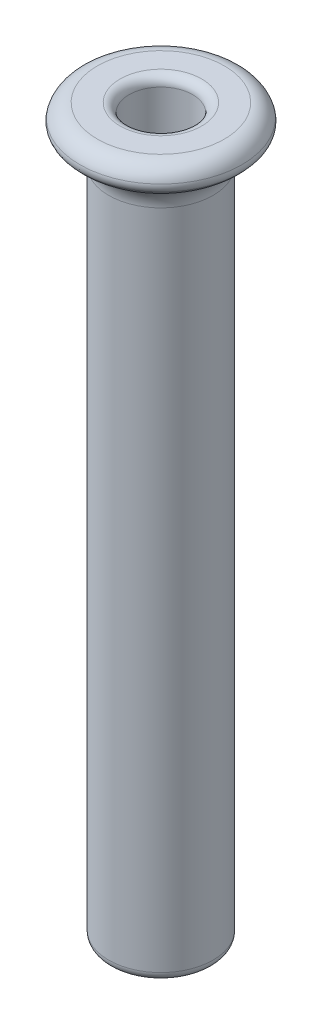
ISO-10303-21;
HEADER;
FILE_DESCRIPTION(('STEP AP214'),'2;1');
FILE_NAME('part.step','',(''),(''),'','','');
FILE_SCHEMA(('AUTOMOTIVE_DESIGN { 1 0 10303 214 1 1 1 1 }'));
ENDSEC;
DATA;
#1=APPLICATION_CONTEXT('core data for automotive mechanical design processes');
#2=APPLICATION_PROTOCOL_DEFINITION('international standard','automotive_design',2000,#1);
#3=PRODUCT_CONTEXT('',#1,'mechanical');
#4=PRODUCT('Part','Part','',(#3));
#5=PRODUCT_RELATED_PRODUCT_CATEGORY('part','',(#4));
#6=PRODUCT_DEFINITION_FORMATION('','',#4);
#7=PRODUCT_DEFINITION_CONTEXT('part definition',#1,'design');
#8=PRODUCT_DEFINITION('design','',#6,#7);
#9=PRODUCT_DEFINITION_SHAPE('','',#8);
#10=(LENGTH_UNIT() NAMED_UNIT(*) SI_UNIT(.MILLI.,.METRE.));
#11=(NAMED_UNIT(*) PLANE_ANGLE_UNIT() SI_UNIT($,.RADIAN.));
#12=(NAMED_UNIT(*) SI_UNIT($,.STERADIAN.) SOLID_ANGLE_UNIT());
#13=UNCERTAINTY_MEASURE_WITH_UNIT(LENGTH_MEASURE(1.E-05),#10,'distance_accuracy_value','');
#14=(GEOMETRIC_REPRESENTATION_CONTEXT(3) GLOBAL_UNCERTAINTY_ASSIGNED_CONTEXT((#13)) GLOBAL_UNIT_ASSIGNED_CONTEXT((#10,
#11,#12)) REPRESENTATION_CONTEXT('',''));
#15=CARTESIAN_POINT('',(0.,0.,0.));
#16=DIRECTION('',(0.,0.,1.));
#17=DIRECTION('',(1.,0.,0.));
#18=AXIS2_PLACEMENT_3D('',#15,#16,#17);
#19=CARTESIAN_POINT('',(2.70989670911976E-13,-79.,0.));
#20=DIRECTION('',(0.,-1.,0.));
#21=DIRECTION('',(1.,0.,0.));
#22=AXIS2_PLACEMENT_3D('',#19,#20,#21);
#23=TOROIDAL_SURFACE('',#22,4.74999999999986,1.);
#24=CARTESIAN_POINT('',(2.74419919910861E-13,-80.,0.));
#25=DIRECTION('',(0.,-1.,0.));
#26=DIRECTION('',(1.,0.,0.));
#27=AXIS2_PLACEMENT_3D('',#24,#25,#26);
#28=CIRCLE('',#27,4.74999999999986);
#29=CARTESIAN_POINT('',(4.75000000000014,-80.,0.));
#30=VERTEX_POINT('',#29);
#31=EDGE_CURVE('E71',#30,#30,#28,.T.);
#32=ORIENTED_EDGE('',*,*,#31,.F.);
#33=EDGE_LOOP('',(#32));
#34=FACE_BOUND('',#33,.T.);
#35=CARTESIAN_POINT('',(2.70989670911976E-13,-79.,0.));
#36=DIRECTION('',(0.,-1.,0.));
#37=DIRECTION('',(1.,0.,0.));
#38=AXIS2_PLACEMENT_3D('',#35,#36,#37);
#39=CIRCLE('',#38,5.74999999999987);
#40=CARTESIAN_POINT('',(5.75000000000014,-79.,0.));
#41=VERTEX_POINT('',#40);
#42=EDGE_CURVE('E68',#41,#41,#39,.F.);
#43=ORIENTED_EDGE('',*,*,#42,.F.);
#44=EDGE_LOOP('',(#43));
#45=FACE_BOUND('',#44,.T.);
#46=ADVANCED_FACE('F45',(#34,#45),#23,.T.);
#47=CARTESIAN_POINT('',(2.70989670911976E-13,-79.,0.));
#48=DIRECTION('',(0.,-1.,0.));
#49=DIRECTION('',(1.,0.,0.));
#50=AXIS2_PLACEMENT_3D('',#47,#48,#49);
#51=TOROIDAL_SURFACE('',#50,3.59999999999985,1.);
#52=CARTESIAN_POINT('',(2.74419919910861E-13,-80.,0.));
#53=DIRECTION('',(0.,-1.,0.));
#54=DIRECTION('',(1.,0.,0.));
#55=AXIS2_PLACEMENT_3D('',#52,#53,#54);
#56=CIRCLE('',#55,3.59999999999985);
#57=CARTESIAN_POINT('',(3.60000000000013,-80.,0.));
#58=VERTEX_POINT('',#57);
#59=EDGE_CURVE('E77',#58,#58,#56,.F.);
#60=ORIENTED_EDGE('',*,*,#59,.F.);
#61=EDGE_LOOP('',(#60));
#62=FACE_BOUND('',#61,.T.);
#63=CARTESIAN_POINT('',(2.70989670911976E-13,-79.,0.));
#64=DIRECTION('',(0.,-1.,0.));
#65=DIRECTION('',(1.,0.,0.));
#66=AXIS2_PLACEMENT_3D('',#63,#64,#65);
#67=CIRCLE('',#66,2.59999999999985);
#68=CARTESIAN_POINT('',(2.60000000000012,-79.,0.));
#69=VERTEX_POINT('',#68);
#70=EDGE_CURVE('E74',#69,#69,#67,.T.);
#71=ORIENTED_EDGE('',*,*,#70,.F.);
#72=EDGE_LOOP('',(#71));
#73=FACE_BOUND('',#72,.T.);
#74=ADVANCED_FACE('F111',(#62,#73),#51,.T.);
#75=CARTESIAN_POINT('',(0.,-8.50000000000001,0.));
#76=DIRECTION('',(0.,1.,0.));
#77=DIRECTION('',(-1.,0.,0.));
#78=AXIS2_PLACEMENT_3D('',#75,#76,#77);
#79=TOROIDAL_SURFACE('',#78,3.09999999999985,0.5);
#80=CARTESIAN_POINT('',(0.,-8.0417424305044,0.));
#81=DIRECTION('',(0.,-1.,0.));
#82=DIRECTION('',(1.,0.,0.));
#83=AXIS2_PLACEMENT_3D('',#80,#81,#82);
#84=CIRCLE('',#83,2.89999999999989);
#85=CARTESIAN_POINT('',(2.89999999999992,-8.04174243050439,0.));
#86=VERTEX_POINT('',#85);
#87=EDGE_CURVE('E52',#86,#86,#84,.F.);
#88=ORIENTED_EDGE('',*,*,#87,.T.);
#89=EDGE_LOOP('',(#88));
#90=FACE_BOUND('',#89,.T.);
#91=CARTESIAN_POINT('',(0.,-8.50000000000001,0.));
#92=DIRECTION('',(0.,1.,0.));
#93=DIRECTION('',(-1.,0.,0.));
#94=AXIS2_PLACEMENT_3D('',#91,#92,#93);
#95=CIRCLE('',#94,2.59999999999985);
#96=CARTESIAN_POINT('',(-2.59999999999982,-8.50000000000002,0.));
#97=VERTEX_POINT('',#96);
#98=EDGE_CURVE('E80',#97,#97,#95,.T.);
#99=ORIENTED_EDGE('',*,*,#98,.F.);
#100=EDGE_LOOP('',(#99));
#101=FACE_BOUND('',#100,.T.);
#102=ADVANCED_FACE('F101',(#90,#101),#79,.T.);
#103=CARTESIAN_POINT('',(0.,-6.00000000000002,0.));
#104=DIRECTION('',(0.,-1.,0.));
#105=DIRECTION('',(1.,0.,0.));
#106=AXIS2_PLACEMENT_3D('',#103,#104,#105);
#107=TOROIDAL_SURFACE('',#106,8.74999999999986,3.);
#108=CARTESIAN_POINT('',(0.,-3.23573758542678,0.));
#109=DIRECTION('',(0.,-1.,0.));
#110=DIRECTION('',(1.,0.,0.));
#111=AXIS2_PLACEMENT_3D('',#108,#109,#110);
#112=CIRCLE('',#111,7.58430136682848);
#113=CARTESIAN_POINT('',(7.5843013668285,-3.23573758542676,0.));
#114=VERTEX_POINT('',#113);
#115=EDGE_CURVE('E65',#114,#114,#112,.T.);
#116=ORIENTED_EDGE('',*,*,#115,.T.);
#117=EDGE_LOOP('',(#116));
#118=FACE_BOUND('',#117,.T.);
#119=CARTESIAN_POINT('',(0.,-6.00000000000002,0.));
#120=DIRECTION('',(0.,-1.,0.));
#121=DIRECTION('',(1.,0.,0.));
#122=AXIS2_PLACEMENT_3D('',#119,#120,#121);
#123=CIRCLE('',#122,5.74999999999987);
#124=CARTESIAN_POINT('',(5.74999999999989,-6.,0.));
#125=VERTEX_POINT('',#124);
#126=EDGE_CURVE('E92',#125,#125,#123,.T.);
#127=ORIENTED_EDGE('',*,*,#126,.F.);
#128=EDGE_LOOP('',(#127));
#129=FACE_BOUND('',#128,.T.);
#130=ADVANCED_FACE('F98',(#118,#129),#107,.F.);
#131=CARTESIAN_POINT('',(0.,0.,0.));
#132=DIRECTION('',(0.,1.,0.));
#133=DIRECTION('',(-1.,0.,0.));
#134=AXIS2_PLACEMENT_3D('',#131,#132,#133);
#135=PLANE('',#134);
#136=CARTESIAN_POINT('',(0.,0.,0.));
#137=DIRECTION('',(0.,1.,0.));
#138=DIRECTION('',(-1.,0.,0.));
#139=AXIS2_PLACEMENT_3D('',#136,#137,#138);
#140=CIRCLE('',#139,4.49999999999999);
#141=CARTESIAN_POINT('',(-4.49999999999999,0.,0.));
#142=VERTEX_POINT('',#141);
#143=EDGE_CURVE('E83',#142,#142,#140,.F.);
#144=ORIENTED_EDGE('',*,*,#143,.T.);
#145=EDGE_LOOP('',(#144));
#146=FACE_BOUND('',#145,.T.);
#147=CARTESIAN_POINT('',(0.,0.,0.));
#148=DIRECTION('',(0.,1.,0.));
#149=DIRECTION('',(-1.,0.,0.));
#150=AXIS2_PLACEMENT_3D('',#147,#148,#149);
#151=CIRCLE('',#150,7.);
#152=CARTESIAN_POINT('',(-7.,0.,0.));
#153=VERTEX_POINT('',#152);
#154=EDGE_CURVE('E89',#153,#153,#151,.T.);
#155=ORIENTED_EDGE('',*,*,#154,.T.);
#156=EDGE_LOOP('',(#155));
#157=FACE_BOUND('',#156,.T.);
#158=ADVANCED_FACE('F100',(#146,#157),#135,.T.);
#159=CARTESIAN_POINT('',(0.,0.,0.));
#160=DIRECTION('',(0.,1.,0.));
#161=DIRECTION('',(-1.,0.,0.));
#162=AXIS2_PLACEMENT_3D('',#159,#160,#161);
#163=CYLINDRICAL_SURFACE('',#162,3.49999999999999);
#164=CARTESIAN_POINT('',(0.,-7.1252272915132,0.));
#165=DIRECTION('',(0.,1.,0.));
#166=DIRECTION('',(-1.,0.,0.));
#167=AXIS2_PLACEMENT_3D('',#164,#165,#166);
#168=CIRCLE('',#167,3.49999999999999);
#169=CARTESIAN_POINT('',(-3.49999999999996,-7.12522729151321,0.));
#170=VERTEX_POINT('',#169);
#171=EDGE_CURVE('E10',#170,#170,#168,.F.);
#172=ORIENTED_EDGE('',*,*,#171,.T.);
#173=EDGE_LOOP('',(#172));
#174=FACE_BOUND('',#173,.T.);
#175=CARTESIAN_POINT('',(0.,-1.00000000000002,0.));
#176=DIRECTION('',(0.,1.,0.));
#177=DIRECTION('',(-1.,0.,0.));
#178=AXIS2_PLACEMENT_3D('',#175,#176,#177);
#179=CIRCLE('',#178,3.49999999999999);
#180=CARTESIAN_POINT('',(-3.49999999999998,-1.00000000000003,0.));
#181=VERTEX_POINT('',#180);
#182=EDGE_CURVE('E86',#181,#181,#179,.T.);
#183=ORIENTED_EDGE('',*,*,#182,.T.);
#184=EDGE_LOOP('',(#183));
#185=FACE_BOUND('',#184,.T.);
#186=ADVANCED_FACE('F108',(#174,#185),#163,.F.);
#187=CARTESIAN_POINT('',(0.,0.,0.));
#188=DIRECTION('',(0.,1.,0.));
#189=DIRECTION('',(-1.,0.,0.));
#190=AXIS2_PLACEMENT_3D('',#187,#188,#189);
#191=CYLINDRICAL_SURFACE('',#190,2.59999999999985);
#192=ORIENTED_EDGE('',*,*,#70,.T.);
#193=EDGE_LOOP('',(#192));
#194=FACE_BOUND('',#193,.T.);
#195=ORIENTED_EDGE('',*,*,#98,.T.);
#196=EDGE_LOOP('',(#195));
#197=FACE_BOUND('',#196,.T.);
#198=ADVANCED_FACE('F159',(#194,#197),#191,.F.);
#199=CARTESIAN_POINT('',(0.,-80.,0.));
#200=DIRECTION('',(0.,-1.,0.));
#201=DIRECTION('',(1.,0.,0.));
#202=AXIS2_PLACEMENT_3D('',#199,#200,#201);
#203=PLANE('',#202);
#204=ORIENTED_EDGE('',*,*,#31,.T.);
#205=EDGE_LOOP('',(#204));
#206=FACE_BOUND('',#205,.T.);
#207=ORIENTED_EDGE('',*,*,#59,.T.);
#208=EDGE_LOOP('',(#207));
#209=FACE_BOUND('',#208,.T.);
#210=ADVANCED_FACE('F153',(#206,#209),#203,.T.);
#211=CARTESIAN_POINT('',(0.,0.,0.));
#212=DIRECTION('',(0.,1.,0.));
#213=DIRECTION('',(-1.,0.,0.));
#214=AXIS2_PLACEMENT_3D('',#211,#212,#213);
#215=CYLINDRICAL_SURFACE('',#214,5.74999999999987);
#216=ORIENTED_EDGE('',*,*,#42,.T.);
#217=EDGE_LOOP('',(#216));
#218=FACE_BOUND('',#217,.T.);
#219=ORIENTED_EDGE('',*,*,#126,.T.);
#220=EDGE_LOOP('',(#219));
#221=FACE_BOUND('',#220,.T.);
#222=ADVANCED_FACE('F96',(#218,#221),#215,.T.);
#223=CARTESIAN_POINT('',(0.,-2.00000000000002,0.));
#224=DIRECTION('',(0.,1.,0.));
#225=DIRECTION('',(-1.,0.,0.));
#226=AXIS2_PLACEMENT_3D('',#223,#224,#225);
#227=TOROIDAL_SURFACE('',#226,7.,2.);
#228=CARTESIAN_POINT('',(0.,-1.47858633897077,0.));
#229=DIRECTION('',(0.,-1.,0.));
#230=DIRECTION('',(1.,0.,0.));
#231=AXIS2_PLACEMENT_3D('',#228,#229,#230);
#232=CIRCLE('',#231,8.93083603500973);
#233=CARTESIAN_POINT('',(8.93083603500974,-1.47858633897074,0.));
#234=VERTEX_POINT('',#233);
#235=EDGE_CURVE('E56',#234,#234,#232,.F.);
#236=ORIENTED_EDGE('',*,*,#235,.T.);
#237=EDGE_LOOP('',(#236));
#238=FACE_BOUND('',#237,.T.);
#239=ORIENTED_EDGE('',*,*,#154,.F.);
#240=EDGE_LOOP('',(#239));
#241=FACE_BOUND('',#240,.T.);
#242=ADVANCED_FACE('F142',(#238,#241),#227,.T.);
#243=CARTESIAN_POINT('',(0.,-1.00000000000002,0.));
#244=DIRECTION('',(0.,1.,0.));
#245=DIRECTION('',(-1.,0.,0.));
#246=AXIS2_PLACEMENT_3D('',#243,#244,#245);
#247=TOROIDAL_SURFACE('',#246,4.49999999999999,1.);
#248=ORIENTED_EDGE('',*,*,#143,.F.);
#249=EDGE_LOOP('',(#248));
#250=FACE_BOUND('',#249,.T.);
#251=ORIENTED_EDGE('',*,*,#182,.F.);
#252=EDGE_LOOP('',(#251));
#253=FACE_BOUND('',#252,.T.);
#254=ADVANCED_FACE('F128',(#250,#253),#247,.T.);
#255=CARTESIAN_POINT('',(0.,-0.471475170853516,0.));
#256=DIRECTION('',(0.,1.,0.));
#257=DIRECTION('',(-1.,0.,0.));
#258=AXIS2_PLACEMENT_3D('',#255,#256,#257);
#259=TOROIDAL_SURFACE('',#258,6.41860273365709,3.);
#260=CARTESIAN_POINT('',(0.,-2.37320216880134,0.));
#261=DIRECTION('',(0.,1.,0.));
#262=DIRECTION('',(-1.,0.,0.));
#263=AXIS2_PLACEMENT_3D('',#260,#261,#262);
#264=CIRCLE('',#263,8.73882565942874);
#265=CARTESIAN_POINT('',(-8.73882565942874,-2.37320216880137,0.));
#266=VERTEX_POINT('',#265);
#267=EDGE_CURVE('E60',#266,#266,#264,.F.);
#268=ORIENTED_EDGE('',*,*,#267,.T.);
#269=EDGE_LOOP('',(#268));
#270=FACE_BOUND('',#269,.T.);
#271=ORIENTED_EDGE('',*,*,#115,.F.);
#272=EDGE_LOOP('',(#271));
#273=FACE_BOUND('',#272,.T.);
#274=ADVANCED_FACE('F125',(#270,#273),#259,.T.);
#275=CARTESIAN_POINT('',(0.,-1.7392931694854,0.));
#276=DIRECTION('',(0.,1.,0.));
#277=DIRECTION('',(-1.,0.,0.));
#278=AXIS2_PLACEMENT_3D('',#275,#276,#277);
#279=TOROIDAL_SURFACE('',#278,7.96541801750486,1.);
#280=ORIENTED_EDGE('',*,*,#235,.F.);
#281=EDGE_LOOP('',(#280));
#282=FACE_BOUND('',#281,.T.);
#283=ORIENTED_EDGE('',*,*,#267,.F.);
#284=EDGE_LOOP('',(#283));
#285=FACE_BOUND('',#284,.T.);
#286=ADVANCED_FACE('F127',(#282,#285),#279,.T.);
#287=CARTESIAN_POINT('',(0.,-7.1252272915132,0.));
#288=DIRECTION('',(0.,1.,0.));
#289=DIRECTION('',(-1.,0.,0.));
#290=AXIS2_PLACEMENT_3D('',#287,#288,#289);
#291=TOROIDAL_SURFACE('',#290,2.49999999999999,1.);
#292=ORIENTED_EDGE('',*,*,#171,.F.);
#293=EDGE_LOOP('',(#292));
#294=FACE_BOUND('',#293,.T.);
#295=ORIENTED_EDGE('',*,*,#87,.F.);
#296=EDGE_LOOP('',(#295));
#297=FACE_BOUND('',#296,.T.);
#298=ADVANCED_FACE('F47',(#294,#297),#291,.F.);
#299=CLOSED_SHELL('',(#46,#74,#102,#130,#158,#186,#198,#210,#222,#242,#254,#274,#286,#298));
#300=MANIFOLD_SOLID_BREP('B2',#299);
#301=ADVANCED_BREP_SHAPE_REPRESENTATION('',(#18,#300),#14);
#302=SHAPE_DEFINITION_REPRESENTATION(#9,#301);
ENDSEC;
END-ISO-10303-21;
